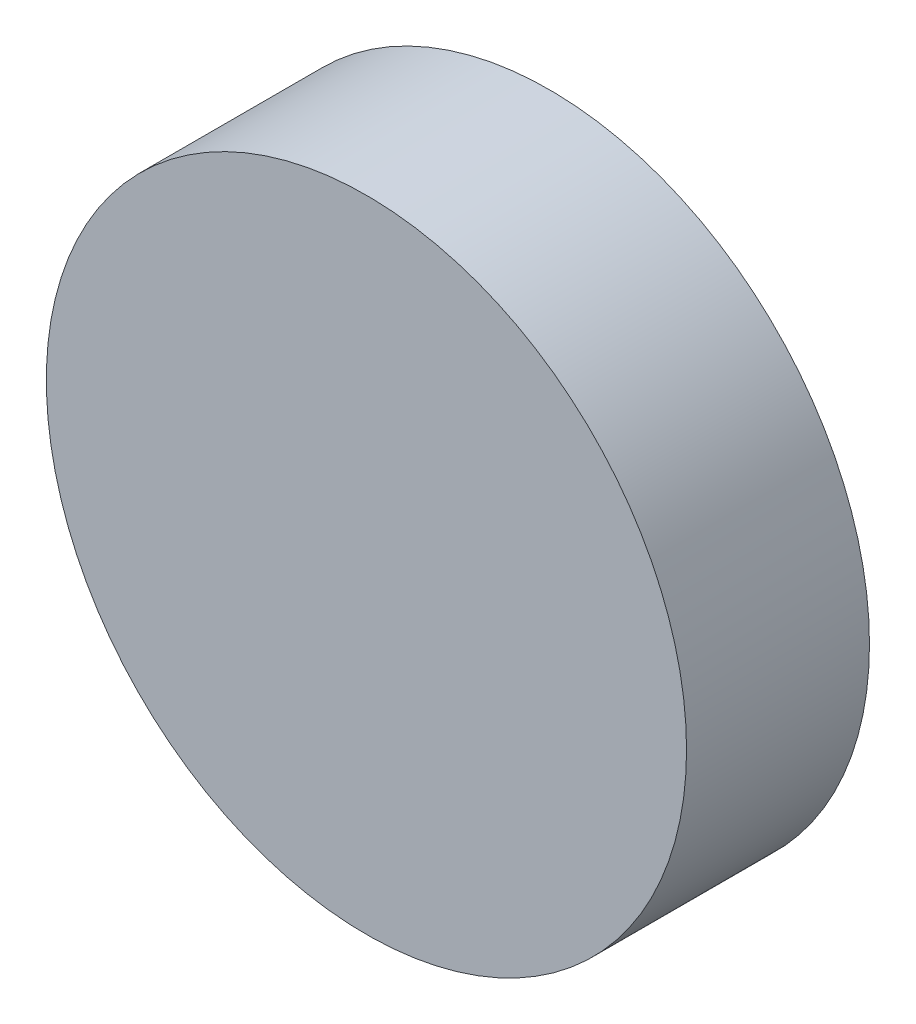
ISO-10303-21;
HEADER;
FILE_DESCRIPTION(('STEP AP214'),'2;1');
FILE_NAME('part.step','',(''),(''),'','','');
FILE_SCHEMA(('AUTOMOTIVE_DESIGN { 1 0 10303 214 1 1 1 1 }'));
ENDSEC;
DATA;
#1=APPLICATION_CONTEXT('core data for automotive mechanical design processes');
#2=APPLICATION_PROTOCOL_DEFINITION('international standard','automotive_design',2000,#1);
#3=PRODUCT_CONTEXT('',#1,'mechanical');
#4=PRODUCT('Part','Part','',(#3));
#5=PRODUCT_RELATED_PRODUCT_CATEGORY('part','',(#4));
#6=PRODUCT_DEFINITION_FORMATION('','',#4);
#7=PRODUCT_DEFINITION_CONTEXT('part definition',#1,'design');
#8=PRODUCT_DEFINITION('design','',#6,#7);
#9=PRODUCT_DEFINITION_SHAPE('','',#8);
#10=(LENGTH_UNIT() NAMED_UNIT(*) SI_UNIT(.MILLI.,.METRE.));
#11=(NAMED_UNIT(*) PLANE_ANGLE_UNIT() SI_UNIT($,.RADIAN.));
#12=(NAMED_UNIT(*) SI_UNIT($,.STERADIAN.) SOLID_ANGLE_UNIT());
#13=UNCERTAINTY_MEASURE_WITH_UNIT(LENGTH_MEASURE(1.E-05),#10,'distance_accuracy_value','');
#14=(GEOMETRIC_REPRESENTATION_CONTEXT(3) GLOBAL_UNCERTAINTY_ASSIGNED_CONTEXT((#13)) GLOBAL_UNIT_ASSIGNED_CONTEXT((#10,
#11,#12)) REPRESENTATION_CONTEXT('',''));
#15=CARTESIAN_POINT('',(0.,0.,0.));
#16=DIRECTION('',(0.,0.,1.));
#17=DIRECTION('',(1.,0.,0.));
#18=AXIS2_PLACEMENT_3D('',#15,#16,#17);
#19=CARTESIAN_POINT('',(0.,0.,20.));
#20=DIRECTION('',(0.,0.,-1.));
#21=DIRECTION('',(-1.,0.,0.));
#22=AXIS2_PLACEMENT_3D('',#19,#20,#21);
#23=CYLINDRICAL_SURFACE('',#22,35.);
#24=CARTESIAN_POINT('',(0.,0.,20.));
#25=DIRECTION('',(0.,0.,1.));
#26=DIRECTION('',(1.,0.,0.));
#27=AXIS2_PLACEMENT_3D('',#24,#25,#26);
#28=CIRCLE('',#27,35.);
#29=CARTESIAN_POINT('',(35.,0.,20.));
#30=VERTEX_POINT('',#29);
#31=EDGE_CURVE('E10',#30,#30,#28,.T.);
#32=ORIENTED_EDGE('',*,*,#31,.F.);
#33=EDGE_LOOP('',(#32));
#34=FACE_BOUND('',#33,.T.);
#35=CARTESIAN_POINT('',(0.,0.,0.));
#36=DIRECTION('',(0.,0.,1.));
#37=DIRECTION('',(1.,0.,0.));
#38=AXIS2_PLACEMENT_3D('',#35,#36,#37);
#39=CIRCLE('',#38,35.);
#40=CARTESIAN_POINT('',(35.,0.,0.));
#41=VERTEX_POINT('',#40);
#42=EDGE_CURVE('E35',#41,#41,#39,.T.);
#43=ORIENTED_EDGE('',*,*,#42,.T.);
#44=EDGE_LOOP('',(#43));
#45=FACE_BOUND('',#44,.T.);
#46=ADVANCED_FACE('F32',(#34,#45),#23,.T.);
#47=CARTESIAN_POINT('',(0.,0.,20.));
#48=DIRECTION('',(0.,0.,1.));
#49=DIRECTION('',(1.,0.,0.));
#50=AXIS2_PLACEMENT_3D('',#47,#48,#49);
#51=PLANE('',#50);
#52=ORIENTED_EDGE('',*,*,#31,.T.);
#53=EDGE_LOOP('',(#52));
#54=FACE_BOUND('',#53,.T.);
#55=ADVANCED_FACE('F47',(#54),#51,.T.);
#56=CARTESIAN_POINT('',(0.,0.,0.));
#57=DIRECTION('',(0.,0.,1.));
#58=DIRECTION('',(1.,0.,0.));
#59=AXIS2_PLACEMENT_3D('',#56,#57,#58);
#60=PLANE('',#59);
#61=ORIENTED_EDGE('',*,*,#42,.F.);
#62=EDGE_LOOP('',(#61));
#63=FACE_BOUND('',#62,.T.);
#64=ADVANCED_FACE('F45',(#63),#60,.F.);
#65=CLOSED_SHELL('',(#46,#55,#64));
#66=MANIFOLD_SOLID_BREP('B2',#65);
#67=ADVANCED_BREP_SHAPE_REPRESENTATION('',(#18,#66),#14);
#68=SHAPE_DEFINITION_REPRESENTATION(#9,#67);
ENDSEC;
END-ISO-10303-21;
